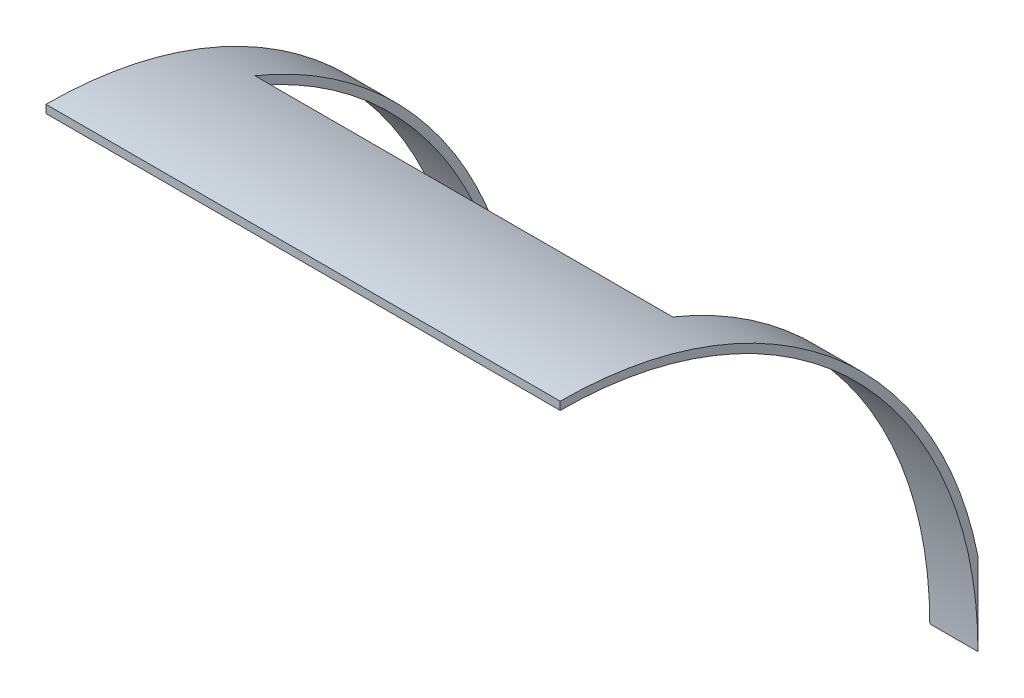
ISO-10303-21;
HEADER;
FILE_DESCRIPTION(('STEP AP214'),'2;1');
FILE_NAME('part.step','',(''),(''),'','','');
FILE_SCHEMA(('AUTOMOTIVE_DESIGN { 1 0 10303 214 1 1 1 1 }'));
ENDSEC;
DATA;
#1=APPLICATION_CONTEXT('core data for automotive mechanical design processes');
#2=APPLICATION_PROTOCOL_DEFINITION('international standard','automotive_design',2000,#1);
#3=PRODUCT_CONTEXT('',#1,'mechanical');
#4=PRODUCT('Part','Part','',(#3));
#5=PRODUCT_RELATED_PRODUCT_CATEGORY('part','',(#4));
#6=PRODUCT_DEFINITION_FORMATION('','',#4);
#7=PRODUCT_DEFINITION_CONTEXT('part definition',#1,'design');
#8=PRODUCT_DEFINITION('design','',#6,#7);
#9=PRODUCT_DEFINITION_SHAPE('','',#8);
#10=(LENGTH_UNIT() NAMED_UNIT(*) SI_UNIT(.MILLI.,.METRE.));
#11=(NAMED_UNIT(*) PLANE_ANGLE_UNIT() SI_UNIT($,.RADIAN.));
#12=(NAMED_UNIT(*) SI_UNIT($,.STERADIAN.) SOLID_ANGLE_UNIT());
#13=UNCERTAINTY_MEASURE_WITH_UNIT(LENGTH_MEASURE(1.E-05),#10,'distance_accuracy_value','');
#14=(GEOMETRIC_REPRESENTATION_CONTEXT(3) GLOBAL_UNCERTAINTY_ASSIGNED_CONTEXT((#13)) GLOBAL_UNIT_ASSIGNED_CONTEXT((#10,
#11,#12)) REPRESENTATION_CONTEXT('',''));
#15=CARTESIAN_POINT('',(0.,0.,0.));
#16=DIRECTION('',(0.,0.,1.));
#17=DIRECTION('',(1.,0.,0.));
#18=AXIS2_PLACEMENT_3D('',#15,#16,#17);
#19=CARTESIAN_POINT('',(-203.2,21.0223484848485,-165.100000000001));
#20=DIRECTION('',(0.,0.,1.));
#21=DIRECTION('',(0.,-1.,0.));
#22=AXIS2_PLACEMENT_3D('',#19,#20,#21);
#23=PLANE('',#22);
#24=DIRECTION('',(1.,0.,0.));
#25=VECTOR('',#24,1.);
#26=CARTESIAN_POINT('',(-168.467424242424,-114.71858283323,-165.1));
#27=LINE('',#26,#25);
#28=CARTESIAN_POINT('',(-203.2,-114.71858283323,-165.1));
#29=VERTEX_POINT('',#28);
#30=CARTESIAN_POINT('',(-184.15,-114.71858283323,-165.1));
#31=VERTEX_POINT('',#30);
#32=EDGE_CURVE('E273',#29,#31,#27,.T.);
#33=ORIENTED_EDGE('',*,*,#32,.T.);
#34=DIRECTION('',(0.,-1.,0.));
#35=VECTOR('',#34,1.);
#36=CARTESIAN_POINT('',(-184.15,21.0223484848485,-165.100000000001));
#37=LINE('',#36,#35);
#38=CARTESIAN_POINT('',(-184.15,-147.252651515152,-165.1));
#39=VERTEX_POINT('',#38);
#40=EDGE_CURVE('E234',#31,#39,#37,.T.);
#41=ORIENTED_EDGE('',*,*,#40,.T.);
#42=DIRECTION('',(1.,0.,0.));
#43=VECTOR('',#42,1.);
#44=CARTESIAN_POINT('',(0.,-147.252651515152,-165.1));
#45=LINE('',#44,#43);
#46=CARTESIAN_POINT('',(-203.2,-147.252651515152,-165.1));
#47=VERTEX_POINT('',#46);
#48=EDGE_CURVE('E210',#47,#39,#45,.T.);
#49=ORIENTED_EDGE('',*,*,#48,.F.);
#50=DIRECTION('',(0.,-1.,0.));
#51=VECTOR('',#50,1.);
#52=CARTESIAN_POINT('',(-203.2,21.0223484848485,-165.100000000001));
#53=LINE('',#52,#51);
#54=EDGE_CURVE('E266',#29,#47,#53,.T.);
#55=ORIENTED_EDGE('',*,*,#54,.F.);
#56=EDGE_LOOP('',(#33,#41,#49,#55));
#57=FACE_BOUND('',#56,.T.);
#58=ADVANCED_FACE('F38',(#57),#23,.F.);
#59=CARTESIAN_POINT('',(0.,-147.252651515152,-165.1));
#60=DIRECTION('',(1.,0.,0.));
#61=DIRECTION('',(0.,0.,-1.));
#62=AXIS2_PLACEMENT_3D('',#59,#60,#61);
#63=PLANE('',#62);
#64=DIRECTION('',(0.,-1.,0.));
#65=VECTOR('',#64,1.);
#66=CARTESIAN_POINT('',(0.,21.0223484848485,-165.100000000001));
#67=LINE('',#66,#65);
#68=CARTESIAN_POINT('',(0.,-114.71858283323,-165.1));
#69=VERTEX_POINT('',#68);
#70=CARTESIAN_POINT('',(0.,-147.252651515152,-165.1));
#71=VERTEX_POINT('',#70);
#72=EDGE_CURVE('E205',#69,#71,#67,.T.);
#73=ORIENTED_EDGE('',*,*,#72,.F.);
#74=CARTESIAN_POINT('',(0.,-147.252651515152,0.));
#75=DIRECTION('',(1.,0.,0.));
#76=DIRECTION('',(0.,0.,-1.));
#77=AXIS2_PLACEMENT_3D('',#74,#75,#76);
#78=CIRCLE('',#77,168.275);
#79=CARTESIAN_POINT('',(0.,21.0223484848485,0.));
#80=VERTEX_POINT('',#79);
#81=EDGE_CURVE('E230',#69,#80,#78,.T.);
#82=ORIENTED_EDGE('',*,*,#81,.T.);
#83=DIRECTION('',(0.,1.,0.));
#84=VECTOR('',#83,1.);
#85=CARTESIAN_POINT('',(0.,17.8473484848485,0.));
#86=LINE('',#85,#84);
#87=CARTESIAN_POINT('',(0.,17.8473484848485,0.));
#88=VERTEX_POINT('',#87);
#89=EDGE_CURVE('E276',#88,#80,#86,.T.);
#90=ORIENTED_EDGE('',*,*,#89,.F.);
#91=CARTESIAN_POINT('',(0.,-147.252651515152,0.));
#92=DIRECTION('',(1.,0.,0.));
#93=DIRECTION('',(0.,0.,-1.));
#94=AXIS2_PLACEMENT_3D('',#91,#92,#93);
#95=CIRCLE('',#94,165.1);
#96=EDGE_CURVE('E216',#71,#88,#95,.T.);
#97=ORIENTED_EDGE('',*,*,#96,.F.);
#98=EDGE_LOOP('',(#73,#82,#90,#97));
#99=FACE_BOUND('',#98,.T.);
#100=ADVANCED_FACE('F150',(#99),#63,.T.);
#101=CARTESIAN_POINT('',(-168.467424242424,-147.252651515152,0.));
#102=DIRECTION('',(1.,0.,0.));
#103=DIRECTION('',(0.,0.,-1.));
#104=AXIS2_PLACEMENT_3D('',#101,#102,#103);
#105=CYLINDRICAL_SURFACE('',#104,168.275);
#106=CARTESIAN_POINT('',(-184.15,-147.252651515152,0.));
#107=DIRECTION('',(-1.,0.,0.));
#108=DIRECTION('',(0.,0.,1.));
#109=AXIS2_PLACEMENT_3D('',#106,#107,#108);
#110=CIRCLE('',#109,168.275);
#111=CARTESIAN_POINT('',(-184.15,8.58131662081041,-63.5));
#112=VERTEX_POINT('',#111);
#113=EDGE_CURVE('E249',#31,#112,#110,.F.);
#114=ORIENTED_EDGE('',*,*,#113,.F.);
#115=ORIENTED_EDGE('',*,*,#32,.F.);
#116=CARTESIAN_POINT('',(-203.2,-147.252651515152,0.));
#117=DIRECTION('',(1.,0.,0.));
#118=DIRECTION('',(0.,0.,-1.));
#119=AXIS2_PLACEMENT_3D('',#116,#117,#118);
#120=CIRCLE('',#119,168.275);
#121=CARTESIAN_POINT('',(-203.2,21.0223484848484,0.));
#122=VERTEX_POINT('',#121);
#123=EDGE_CURVE('E227',#29,#122,#120,.T.);
#124=ORIENTED_EDGE('',*,*,#123,.T.);
#125=DIRECTION('',(-1.,0.,0.));
#126=VECTOR('',#125,1.);
#127=CARTESIAN_POINT('',(0.,21.0223484848485,0.));
#128=LINE('',#127,#126);
#129=EDGE_CURVE('E280',#80,#122,#128,.T.);
#130=ORIENTED_EDGE('',*,*,#129,.F.);
#131=ORIENTED_EDGE('',*,*,#81,.F.);
#132=CARTESIAN_POINT('',(-19.05,-114.71858283323,-165.1));
#133=VERTEX_POINT('',#132);
#134=EDGE_CURVE('E270',#133,#69,#27,.T.);
#135=ORIENTED_EDGE('',*,*,#134,.F.);
#136=CARTESIAN_POINT('',(-19.0499999999999,-147.252651515152,0.));
#137=DIRECTION('',(1.,0.,0.));
#138=DIRECTION('',(0.,0.,-1.));
#139=AXIS2_PLACEMENT_3D('',#136,#137,#138);
#140=CIRCLE('',#139,168.275);
#141=CARTESIAN_POINT('',(-19.05,8.58131662081041,-63.5));
#142=VERTEX_POINT('',#141);
#143=EDGE_CURVE('E255',#142,#133,#140,.F.);
#144=ORIENTED_EDGE('',*,*,#143,.F.);
#145=DIRECTION('',(1.,0.,0.));
#146=VECTOR('',#145,1.);
#147=CARTESIAN_POINT('',(-168.467424242424,8.58131662081041,-63.5));
#148=LINE('',#147,#146);
#149=EDGE_CURVE('E259',#112,#142,#148,.T.);
#150=ORIENTED_EDGE('',*,*,#149,.F.);
#151=EDGE_LOOP('',(#114,#115,#124,#130,#131,#135,#144,#150));
#152=FACE_BOUND('',#151,.T.);
#153=ADVANCED_FACE('F168',(#152),#105,.T.);
#154=CARTESIAN_POINT('',(-203.2,-147.252651515152,-165.1));
#155=DIRECTION('',(-1.,0.,0.));
#156=DIRECTION('',(0.,0.,1.));
#157=AXIS2_PLACEMENT_3D('',#154,#155,#156);
#158=PLANE('',#157);
#159=ORIENTED_EDGE('',*,*,#54,.T.);
#160=CARTESIAN_POINT('',(-203.2,-147.252651515152,0.));
#161=DIRECTION('',(1.,0.,0.));
#162=DIRECTION('',(0.,0.,-1.));
#163=AXIS2_PLACEMENT_3D('',#160,#161,#162);
#164=CIRCLE('',#163,165.1);
#165=CARTESIAN_POINT('',(-203.2,17.8473484848484,0.));
#166=VERTEX_POINT('',#165);
#167=EDGE_CURVE('E224',#47,#166,#164,.T.);
#168=ORIENTED_EDGE('',*,*,#167,.T.);
#169=DIRECTION('',(0.,-1.,0.));
#170=VECTOR('',#169,1.);
#171=CARTESIAN_POINT('',(-203.2,17.8473484848484,0.));
#172=LINE('',#171,#170);
#173=EDGE_CURVE('E218',#122,#166,#172,.T.);
#174=ORIENTED_EDGE('',*,*,#173,.F.);
#175=ORIENTED_EDGE('',*,*,#123,.F.);
#176=EDGE_LOOP('',(#159,#168,#174,#175));
#177=FACE_BOUND('',#176,.T.);
#178=ADVANCED_FACE('F149',(#177),#158,.T.);
#179=CARTESIAN_POINT('',(-168.467424242424,-147.252651515152,0.));
#180=DIRECTION('',(1.,0.,0.));
#181=DIRECTION('',(0.,0.,-1.));
#182=AXIS2_PLACEMENT_3D('',#179,#180,#181);
#183=CYLINDRICAL_SURFACE('',#182,165.1);
#184=CARTESIAN_POINT('',(-114.088881491951,9.89312701008041,-50.6281966072142));
#185=CARTESIAN_POINT('',(-113.953864967336,9.89648283792673,-50.6177679238339));
#186=CARTESIAN_POINT('',(-113.8197646852,9.90314322707458,-50.5971034012265));
#187=CARTESIAN_POINT('',(-113.556579227393,9.92275957601486,-50.536140585704));
#188=CARTESIAN_POINT('',(-113.427494010849,9.93571548448531,-50.4958424528449));
#189=CARTESIAN_POINT('',(-113.168218921054,9.9687959669173,-50.3927523318355));
#190=CARTESIAN_POINT('',(-113.038661540678,9.98938221629171,-50.3285097323128));
#191=CARTESIAN_POINT('',(-112.792773388055,10.0367911861759,-50.1801482695945));
#192=CARTESIAN_POINT('',(-112.676441066389,10.0636131749964,-50.0960317383481));
#193=CARTESIAN_POINT('',(-112.46060136038,10.1225722221402,-49.910503605895));
#194=CARTESIAN_POINT('',(-112.361050899353,10.1546952401958,-49.8091376697895));
#195=CARTESIAN_POINT('',(-112.181243779611,10.223303379392,-49.5917996601005));
#196=CARTESIAN_POINT('',(-112.100989230724,10.2597889768877,-49.4758259914081));
#197=CARTESIAN_POINT('',(-111.962189231237,10.3359234029204,-49.2327860323058));
#198=CARTESIAN_POINT('',(-111.903604977116,10.375566421402,-49.105740077474));
#199=CARTESIAN_POINT('',(-111.809567792174,10.4568745862024,-48.8439775591242));
#200=CARTESIAN_POINT('',(-111.774113734367,10.4985396338944,-48.709261369675));
#201=CARTESIAN_POINT('',(-111.727229487801,10.5827509081338,-48.435691960157));
#202=CARTESIAN_POINT('',(-111.71584535929,10.6252986670888,-48.2968313230232));
#203=CARTESIAN_POINT('',(-111.717489810818,10.7099848109688,-48.0191274483818));
#204=CARTESIAN_POINT('',(-111.730519575769,10.7521231759244,-47.8802842120457));
#205=CARTESIAN_POINT('',(-111.780693326579,10.8350311075397,-47.6058322128621));
#206=CARTESIAN_POINT('',(-111.81795606898,10.8757928877095,-47.4702428070376));
#207=CARTESIAN_POINT('',(-111.915624553837,10.9546277485847,-47.2068395959073));
#208=CARTESIAN_POINT('',(-111.976030840499,10.9927007660405,-47.0790259735262));
#209=CARTESIAN_POINT('',(-112.118566401146,11.0652990206616,-46.8343133877871));
#210=CARTESIAN_POINT('',(-112.200779679955,11.0998098054907,-46.7174590499745));
#211=CARTESIAN_POINT('',(-112.3845180036,11.1642138195618,-46.4986001368616));
#212=CARTESIAN_POINT('',(-112.486043072292,11.1941070431,-46.3965955799047));
#213=CARTESIAN_POINT('',(-112.705421196394,11.2484681118335,-46.2105451481514));
#214=CARTESIAN_POINT('',(-112.823252997838,11.2729429130869,-46.1264762530242));
#215=CARTESIAN_POINT('',(-113.07202236283,11.3158832715007,-45.9786442206666));
#216=CARTESIAN_POINT('',(-113.202959433907,11.3343490543581,-45.9148803207883));
#217=CARTESIAN_POINT('',(-113.473322214288,11.3646930923856,-45.8099440218837));
#218=CARTESIAN_POINT('',(-113.612687560275,11.3766131713524,-45.7686282091056));
#219=CARTESIAN_POINT('',(-113.896681450781,11.3937389278678,-45.7092306539477));
#220=CARTESIAN_POINT('',(-114.041309762981,11.3989449014232,-45.6911478872857));
#221=CARTESIAN_POINT('',(-114.330695078611,11.402495590362,-45.6788171745483));
#222=CARTESIAN_POINT('',(-114.475444828047,11.4008857107417,-45.6844114993092));
#223=CARTESIAN_POINT('',(-114.761902576745,11.3909493370748,-45.7189044551592));
#224=CARTESIAN_POINT('',(-114.903610616054,11.3826229315178,-45.7478027792203));
#225=CARTESIAN_POINT('',(-115.179804909472,11.3594813382026,-45.8279721913004));
#226=CARTESIAN_POINT('',(-115.314299537102,11.3446738652349,-45.8792166791169));
#227=CARTESIAN_POINT('',(-115.572492447375,11.3089481352383,-46.0025349005448));
#228=CARTESIAN_POINT('',(-115.696190447911,11.2880297185975,-46.0746091782093));
#229=CARTESIAN_POINT('',(-115.929993132431,11.2404835568521,-46.2378998254948));
#230=CARTESIAN_POINT('',(-116.040022768986,11.2138263136902,-46.3292150416234));
#231=CARTESIAN_POINT('',(-116.242696457055,11.1555429795383,-46.5281058322064));
#232=CARTESIAN_POINT('',(-116.33533975823,11.1239166742078,-46.6356821080746));
#233=CARTESIAN_POINT('',(-116.501300487752,11.0562527039236,-46.8648610231501));
#234=CARTESIAN_POINT('',(-116.574473265183,11.0201847823264,-46.9865594991959));
#235=CARTESIAN_POINT('',(-116.698560579972,10.9447599424912,-47.2398820435919));
#236=CARTESIAN_POINT('',(-116.749474599546,10.9054029477679,-47.3715063427536));
#237=CARTESIAN_POINT('',(-116.827726652955,10.8243069792286,-47.6414221460968));
#238=CARTESIAN_POINT('',(-116.854983130664,10.7825602901794,-47.7797349922863));
#239=CARTESIAN_POINT('',(-116.88479630023,10.6979602366697,-48.0586670755109));
#240=CARTESIAN_POINT('',(-116.887353223117,10.6551068825643,-48.1992862909607));
#241=CARTESIAN_POINT('',(-116.867650934016,10.5696171947503,-48.4784773505632));
#242=CARTESIAN_POINT('',(-116.845450726748,10.5269805872944,-48.6170532685359));
#243=CARTESIAN_POINT('',(-116.776896378733,10.4430740524975,-48.888529663555));
#244=CARTESIAN_POINT('',(-116.730542772525,10.4018040949326,-49.0214302661315));
#245=CARTESIAN_POINT('',(-116.615262369301,10.3220846140373,-49.2770777371137));
#246=CARTESIAN_POINT('',(-116.546452317756,10.2836217365699,-49.3998730917904));
#247=CARTESIAN_POINT('',(-116.388143345511,10.2104679246595,-49.6325589897216));
#248=CARTESIAN_POINT('',(-116.298646439971,10.1757766233011,-49.7424507883743));
#249=CARTESIAN_POINT('',(-116.10185864646,10.1113548631358,-49.9458793761021));
#250=CARTESIAN_POINT('',(-115.994629475148,10.0816078916347,-50.0394706566557));
#251=CARTESIAN_POINT('',(-115.765165063234,10.0278505288875,-50.2081820703109));
#252=CARTESIAN_POINT('',(-115.642923446735,10.0038425878935,-50.2832943142727));
#253=CARTESIAN_POINT('',(-115.38679097086,9.96230392416413,-50.4130185415438));
#254=CARTESIAN_POINT('',(-115.252883611301,9.94478256609431,-50.4676008876864));
#255=CARTESIAN_POINT('',(-114.977550495011,9.91684788560559,-50.5545310096153));
#256=CARTESIAN_POINT('',(-114.836139479244,9.90642114520455,-50.5869207588612));
#257=CARTESIAN_POINT('',(-114.632632217169,9.89683561697325,-50.61668401816));
#258=CARTESIAN_POINT('',(-114.571947084054,9.89464747085823,-50.6234756740519));
#259=CARTESIAN_POINT('',(-114.51111850805,9.89312701008042,-50.6281966072142));
#260=B_SPLINE_CURVE_WITH_KNOTS('',3,(#184,#185,#186,#187,#188,#189,#190,#191,#192,#193,#194,
#195,#196,#197,#198,#199,#200,#201,#202,#203,#204,#205,#206,#207,#208,#209,#210,#211,#212,#213,
#214,#215,#216,#217,#218,#219,#220,#221,#222,#223,#224,#225,#226,#227,#228,#229,#230,#231,#232,
#233,#234,#235,#236,#237,#238,#239,#240,#241,#242,#243,#244,#245,#246,#247,#248,#249,#250,#251,
#252,#253,#254,#255,#256,#257,#258,#259),.UNSPECIFIED.,.F.,.F.,(4,2,2,2,2,2,2,2,2,2,2,2,2,2,2,2,
2,2,2,2,2,2,2,2,2,2,2,2,2,2,2,2,2,2,2,2,2,4),(0.,0.405897792881434,0.811792276881501,
1.24788858801271,1.68393375426732,2.11884202389486,2.55379782509393,2.98797096643424,
3.42212295172905,3.85710498170018,4.29210812378009,4.72925927936226,5.16642071492141,
5.6052912756162,6.04416237842587,6.48246675773591,6.92075467255581,7.35620855686503,
7.79164324252874,8.22418178422561,8.65671462736075,9.08873399590572,9.52076464938411,
9.95507138511682,10.3893968598327,10.8268642336805,11.2643417833822,11.7033215540623,
12.1422972186679,12.5802288857055,13.0181508612885,13.4538315199418,13.8894697556654,
14.3236225005022,14.7579602750679,15.192922679172,15.6270601392852,15.8102048139839),.UNSPECIFIED.);
#261=CARTESIAN_POINT('',(-111.7473,10.7790171564204,-47.7912303344296));
#262=VERTEX_POINT('',#261);
#263=CARTESIAN_POINT('',(-116.8527,10.7790171564204,-47.7912303344296));
#264=VERTEX_POINT('',#263);
#265=EDGE_CURVE('E11',#262,#264,#260,.T.);
#266=ORIENTED_EDGE('',*,*,#265,.F.);
#267=CARTESIAN_POINT('',(-116.8527,10.7790171564204,-47.7912303344296));
#268=CARTESIAN_POINT('',(-116.852706723487,10.7580984438365,-47.8604040083973));
#269=CARTESIAN_POINT('',(-116.849657770327,10.7371343055739,-47.9295608281803));
#270=CARTESIAN_POINT('',(-116.837498221817,10.6952655628439,-48.0673552008376));
#271=CARTESIAN_POINT('',(-116.828387830451,10.6743609563968,-48.1359927711074));
#272=CARTESIAN_POINT('',(-116.804161941685,10.6327719617872,-48.2722293904731));
#273=CARTESIAN_POINT('',(-116.789049832891,10.6120874561095,-48.3398290032742));
#274=CARTESIAN_POINT('',(-116.752938667079,10.5710854080629,-48.4735284812327));
#275=CARTESIAN_POINT('',(-116.731939701466,10.5507678600014,-48.5396283696592));
#276=CARTESIAN_POINT('',(-116.660272023001,10.4905686320245,-48.7350489437571));
#277=CARTESIAN_POINT('',(-116.600923960506,10.4514257165825,-48.8615385031071));
#278=CARTESIAN_POINT('',(-116.460832289864,10.3764145034923,-49.1029896073938));
#279=CARTESIAN_POINT('',(-116.380093856331,10.3405454166796,-49.2179539311776));
#280=CARTESIAN_POINT('',(-116.199674104274,10.2732408774229,-49.4329433956312));
#281=CARTESIAN_POINT('',(-116.100037978656,10.2417951529897,-49.533003180788));
#282=CARTESIAN_POINT('',(-115.884502224959,10.1842382322724,-49.7156408578967));
#283=CARTESIAN_POINT('',(-115.76860027764,10.1581277980201,-49.7982162526389));
#284=CARTESIAN_POINT('',(-115.524279842504,10.1121724651621,-49.9432473978637));
#285=CARTESIAN_POINT('',(-115.395907486865,10.0923055445948,-50.0057738805716));
#286=CARTESIAN_POINT('',(-115.129958815834,10.0593600115418,-50.109320485987));
#287=CARTESIAN_POINT('',(-114.992383246034,10.0462808499008,-50.1503423485027));
#288=CARTESIAN_POINT('',(-114.712306765172,10.0273634771873,-50.2096391155746));
#289=CARTESIAN_POINT('',(-114.569819441666,10.0215067168252,-50.227972291907));
#290=CARTESIAN_POINT('',(-114.283634257981,10.0171653950384,-50.2415638959183));
#291=CARTESIAN_POINT('',(-114.139936380342,10.018680940138,-50.2368219901793));
#292=CARTESIAN_POINT('',(-113.855582444351,10.0290286430437,-50.2044158347068));
#293=CARTESIAN_POINT('',(-113.714923150439,10.0378525801793,-50.1767773396476));
#294=CARTESIAN_POINT('',(-113.440468805916,10.0625167662864,-50.0993958441475));
#295=CARTESIAN_POINT('',(-113.306673730611,10.078356990014,-50.0496529232361));
#296=CARTESIAN_POINT('',(-113.049661220135,10.1165482110865,-49.9294395866035));
#297=CARTESIAN_POINT('',(-112.926449538155,10.1389027209925,-49.8589579882031));
#298=CARTESIAN_POINT('',(-112.694161755166,10.1893980408288,-49.6992758415473));
#299=CARTESIAN_POINT('',(-112.585085074511,10.2175386133623,-49.6100760612785));
#300=CARTESIAN_POINT('',(-112.383918579943,10.2787738727269,-49.4152854478491));
#301=CARTESIAN_POINT('',(-112.291862180267,10.3118780783196,-49.3096631064216));
#302=CARTESIAN_POINT('',(-112.127537438532,10.3819820224861,-49.0850906227843));
#303=CARTESIAN_POINT('',(-112.05527563683,10.418983043034,-48.9661360937203));
#304=CARTESIAN_POINT('',(-111.93233765924,10.4958842010233,-48.7178246385475));
#305=CARTESIAN_POINT('',(-111.881746110721,10.5357950049176,-48.5884292329906));
#306=CARTESIAN_POINT('',(-111.803999253733,10.6171719522911,-48.3233687522778));
#307=CARTESIAN_POINT('',(-111.776809114573,10.6586356880535,-48.1877133127778));
#308=CARTESIAN_POINT('',(-111.756861158975,10.7133668208273,-48.0078026466238));
#309=CARTESIAN_POINT('',(-111.753273631802,10.7265119018791,-47.9645284276489));
#310=CARTESIAN_POINT('',(-111.748496322787,10.7527811820205,-47.8779205111355));
#311=CARTESIAN_POINT('',(-111.747302549931,10.7659053793535,-47.8345870333387));
#312=CARTESIAN_POINT('',(-111.7473,10.7790171564204,-47.7912303344296));
#313=B_SPLINE_CURVE_WITH_KNOTS('',3,(#267,#268,#269,#270,#271,#272,#273,#274,#275,#276,#277,
#278,#279,#280,#281,#282,#283,#284,#285,#286,#287,#288,#289,#290,#291,#292,#293,#294,#295,#296,
#297,#298,#299,#300,#301,#302,#303,#304,#305,#306,#307,#308,#309,#310,#311,#312),.UNSPECIFIED.,
.F.,.F.,(4,2,2,2,2,2,2,2,2,2,2,2,2,2,2,2,2,2,2,2,2,2,4),(0.,0.216732674808425,0.433458056364749,
0.650061247032096,0.866661074657473,1.29971001569877,1.73265429200337,2.16457596813762,
2.59655929197831,3.02700137516794,3.45740862852715,3.88670814930032,4.31601387315273,
4.74483735747291,5.17365929893839,5.60271289421249,6.03174888932852,6.4616184265804,
6.8916298266928,7.32330554061443,7.7543376311036,7.89039947820821,8.02623428549849),.UNSPECIFIED.);
#314=EDGE_CURVE('E52',#264,#262,#313,.T.);
#315=ORIENTED_EDGE('',*,*,#314,.F.);
#316=EDGE_LOOP('',(#266,#315));
#317=FACE_BOUND('',#316,.T.);
#318=CARTESIAN_POINT('',(-63.2888814919507,9.89312701008041,-50.6281966072142));
#319=CARTESIAN_POINT('',(-63.1538649673364,9.89648283792672,-50.6177679238339));
#320=CARTESIAN_POINT('',(-63.0197646851999,9.90314322707457,-50.5971034012264));
#321=CARTESIAN_POINT('',(-62.7565792273932,9.92275957601485,-50.5361405857039));
#322=CARTESIAN_POINT('',(-62.6274940108488,9.9357154844853,-50.4958424528449));
#323=CARTESIAN_POINT('',(-62.3682189210545,9.96879596691729,-50.3927523318356));
#324=CARTESIAN_POINT('',(-62.2386615406784,9.98938221629169,-50.3285097323128));
#325=CARTESIAN_POINT('',(-61.9927733880555,10.0367911861759,-50.1801482695945));
#326=CARTESIAN_POINT('',(-61.8764410663891,10.0636131749964,-50.0960317383482));
#327=CARTESIAN_POINT('',(-61.6606013603798,10.1225722221402,-49.9105036058951));
#328=CARTESIAN_POINT('',(-61.5610508993528,10.1546952401957,-49.8091376697896));
#329=CARTESIAN_POINT('',(-61.3812437796106,10.223303379392,-49.5917996601006));
#330=CARTESIAN_POINT('',(-61.3009892307241,10.2597889768877,-49.4758259914081));
#331=CARTESIAN_POINT('',(-61.1621892312365,10.3359234029204,-49.2327860323059));
#332=CARTESIAN_POINT('',(-61.1036049771164,10.375566421402,-49.1057400774741));
#333=CARTESIAN_POINT('',(-61.0095677921743,10.4568745862023,-48.8439775591242));
#334=CARTESIAN_POINT('',(-60.9741137343667,10.4985396338943,-48.7092613696751));
#335=CARTESIAN_POINT('',(-60.9272294878007,10.5827509081337,-48.435691960157));
#336=CARTESIAN_POINT('',(-60.9158453592903,10.6252986670887,-48.2968313230233));
#337=CARTESIAN_POINT('',(-60.9174898108183,10.7099848109687,-48.0191274483819));
#338=CARTESIAN_POINT('',(-60.9305195757687,10.7521231759244,-47.8802842120458));
#339=CARTESIAN_POINT('',(-60.9806933265787,10.8350311075397,-47.6058322128622));
#340=CARTESIAN_POINT('',(-61.0179560689803,10.8757928877094,-47.4702428070377));
#341=CARTESIAN_POINT('',(-61.1156245538372,10.9546277485846,-47.2068395959073));
#342=CARTESIAN_POINT('',(-61.176030840499,10.9927007660405,-47.0790259735263));
#343=CARTESIAN_POINT('',(-61.3185664011458,11.0652990206616,-46.8343133877872));
#344=CARTESIAN_POINT('',(-61.4007796799547,11.0998098054907,-46.7174590499746));
#345=CARTESIAN_POINT('',(-61.5845180036004,11.1642138195618,-46.4986001368617));
#346=CARTESIAN_POINT('',(-61.686043072292,11.1941070431,-46.3965955799047));
#347=CARTESIAN_POINT('',(-61.9054211963943,11.2484681118335,-46.2105451481515));
#348=CARTESIAN_POINT('',(-62.0232529978379,11.2729429130869,-46.1264762530242));
#349=CARTESIAN_POINT('',(-62.2720223628301,11.3158832715007,-45.9786442206666));
#350=CARTESIAN_POINT('',(-62.4029594339068,11.3343490543581,-45.9148803207883));
#351=CARTESIAN_POINT('',(-62.6733222142877,11.3646930923856,-45.8099440218838));
#352=CARTESIAN_POINT('',(-62.8126875602749,11.3766131713524,-45.7686282091056));
#353=CARTESIAN_POINT('',(-63.0966814507808,11.3937389278678,-45.7092306539477));
#354=CARTESIAN_POINT('',(-63.2413097629805,11.3989449014232,-45.6911478872857));
#355=CARTESIAN_POINT('',(-63.5306950786111,11.402495590362,-45.6788171745483));
#356=CARTESIAN_POINT('',(-63.6754448280474,11.4008857107417,-45.6844114993092));
#357=CARTESIAN_POINT('',(-63.9619025767446,11.3909493370748,-45.7189044551592));
#358=CARTESIAN_POINT('',(-64.1036106160544,11.3826229315178,-45.7478027792203));
#359=CARTESIAN_POINT('',(-64.3798049094723,11.3594813382026,-45.8279721913004));
#360=CARTESIAN_POINT('',(-64.5142995371022,11.3446738652349,-45.8792166791169));
#361=CARTESIAN_POINT('',(-64.7724924473752,11.3089481352383,-46.0025349005447));
#362=CARTESIAN_POINT('',(-64.8961904479113,11.2880297185975,-46.0746091782093));
#363=CARTESIAN_POINT('',(-65.1299931324312,11.2404835568522,-46.2378998254947));
#364=CARTESIAN_POINT('',(-65.2400227689863,11.2138263136902,-46.3292150416233));
#365=CARTESIAN_POINT('',(-65.4426964570549,11.1555429795384,-46.5281058322063));
#366=CARTESIAN_POINT('',(-65.5353397582295,11.1239166742078,-46.6356821080745));
#367=CARTESIAN_POINT('',(-65.7013004877523,11.0562527039236,-46.86486102315));
#368=CARTESIAN_POINT('',(-65.7744732651825,11.0201847823264,-46.9865594991959));
#369=CARTESIAN_POINT('',(-65.8985605799719,10.9447599424912,-47.2398820435918));
#370=CARTESIAN_POINT('',(-65.9494745995464,10.9054029477679,-47.3715063427535));
#371=CARTESIAN_POINT('',(-66.0277266529546,10.8243069792286,-47.6414221460968));
#372=CARTESIAN_POINT('',(-66.0549831306643,10.7825602901794,-47.7797349922863));
#373=CARTESIAN_POINT('',(-66.0847963002298,10.6979602366697,-48.0586670755108));
#374=CARTESIAN_POINT('',(-66.087353223117,10.6551068825644,-48.1992862909606));
#375=CARTESIAN_POINT('',(-66.0676509340164,10.5696171947503,-48.4784773505631));
#376=CARTESIAN_POINT('',(-66.0454507267478,10.5269805872944,-48.6170532685357));
#377=CARTESIAN_POINT('',(-65.9768963787326,10.4430740524975,-48.8885296635549));
#378=CARTESIAN_POINT('',(-65.9305427725248,10.4018040949327,-49.0214302661314));
#379=CARTESIAN_POINT('',(-65.8152623693011,10.3220846140373,-49.2770777371136));
#380=CARTESIAN_POINT('',(-65.7464523177563,10.2836217365699,-49.3998730917903));
#381=CARTESIAN_POINT('',(-65.5881433455108,10.2104679246596,-49.6325589897216));
#382=CARTESIAN_POINT('',(-65.4986464399711,10.1757766233011,-49.7424507883742));
#383=CARTESIAN_POINT('',(-65.3018586464602,10.1113548631358,-49.9458793761021));
#384=CARTESIAN_POINT('',(-65.1946294751484,10.0816078916347,-50.0394706566557));
#385=CARTESIAN_POINT('',(-64.9651650632345,10.0278505288876,-50.2081820703109));
#386=CARTESIAN_POINT('',(-64.8429234467355,10.0038425878935,-50.2832943142726));
#387=CARTESIAN_POINT('',(-64.58679097086,9.96230392416414,-50.4130185415438));
#388=CARTESIAN_POINT('',(-64.452883611301,9.94478256609433,-50.4676008876864));
#389=CARTESIAN_POINT('',(-64.1775504950112,9.9168478856056,-50.5545310096153));
#390=CARTESIAN_POINT('',(-64.0361394792443,9.90642114520456,-50.5869207588611));
#391=CARTESIAN_POINT('',(-63.8326322171694,9.89683561697325,-50.61668401816));
#392=CARTESIAN_POINT('',(-63.7719470840541,9.89464747085824,-50.6234756740519));
#393=CARTESIAN_POINT('',(-63.7111185080496,9.89312701008042,-50.6281966072142));
#394=B_SPLINE_CURVE_WITH_KNOTS('',3,(#318,#319,#320,#321,#322,#323,#324,#325,#326,#327,#328,
#329,#330,#331,#332,#333,#334,#335,#336,#337,#338,#339,#340,#341,#342,#343,#344,#345,#346,#347,
#348,#349,#350,#351,#352,#353,#354,#355,#356,#357,#358,#359,#360,#361,#362,#363,#364,#365,#366,
#367,#368,#369,#370,#371,#372,#373,#374,#375,#376,#377,#378,#379,#380,#381,#382,#383,#384,#385,
#386,#387,#388,#389,#390,#391,#392,#393),.UNSPECIFIED.,.F.,.F.,(4,2,2,2,2,2,2,2,2,2,2,2,2,2,2,2,
2,2,2,2,2,2,2,2,2,2,2,2,2,2,2,2,2,2,2,2,2,4),(0.,0.405897792881439,0.811792276881505,
1.24788858801268,1.68393375426732,2.11884202389484,2.55379782509391,2.98797096643421,
3.42212295172903,3.85710498170016,4.29210812378006,4.72925927936223,5.16642071492138,
5.60529127561616,6.04416237842583,6.48246675773588,6.92075467255578,7.356208556865,
7.79164324252871,8.2241817842256,8.65671462736073,9.08873399590569,9.52076464938408,
9.95507138511678,10.3893968598326,10.8268642336804,11.2643417833822,11.7033215540623,
12.1422972186679,12.5802288857054,13.0181508612884,13.4538315199417,13.8894697556653,
14.3236225005021,14.7579602750678,15.1929226791719,15.6270601392851,15.810204813984),.UNSPECIFIED.);
#395=CARTESIAN_POINT('',(-60.9473,10.7790171564204,-47.7912303344296));
#396=VERTEX_POINT('',#395);
#397=CARTESIAN_POINT('',(-66.0527,10.7790171564204,-47.7912303344296));
#398=VERTEX_POINT('',#397);
#399=EDGE_CURVE('E130',#396,#398,#394,.T.);
#400=ORIENTED_EDGE('',*,*,#399,.F.);
#401=CARTESIAN_POINT('',(-66.0527,10.7790171564204,-47.7912303344296));
#402=CARTESIAN_POINT('',(-66.0527067234873,10.7580984438365,-47.8604040083973));
#403=CARTESIAN_POINT('',(-66.0496577703268,10.7371343055739,-47.9295608281803));
#404=CARTESIAN_POINT('',(-66.0374982218168,10.6952655628439,-48.0673552008376));
#405=CARTESIAN_POINT('',(-66.0283878304507,10.6743609563968,-48.1359927711074));
#406=CARTESIAN_POINT('',(-66.0041619416849,10.6327719617872,-48.2722293904731));
#407=CARTESIAN_POINT('',(-65.9890498328911,10.6120874561095,-48.3398290032742));
#408=CARTESIAN_POINT('',(-65.9529386670789,10.5710854080629,-48.4735284812327));
#409=CARTESIAN_POINT('',(-65.9319397014664,10.5507678600014,-48.5396283696592));
#410=CARTESIAN_POINT('',(-65.860272023001,10.4905686320245,-48.7350489437571));
#411=CARTESIAN_POINT('',(-65.8009239605059,10.4514257165825,-48.8615385031071));
#412=CARTESIAN_POINT('',(-65.6608322898644,10.3764145034923,-49.1029896073938));
#413=CARTESIAN_POINT('',(-65.5800938563305,10.3405454166796,-49.2179539311776));
#414=CARTESIAN_POINT('',(-65.3996741042744,10.2732408774229,-49.4329433956312));
#415=CARTESIAN_POINT('',(-65.3000379786555,10.2417951529897,-49.533003180788));
#416=CARTESIAN_POINT('',(-65.0845022249594,10.1842382322724,-49.7156408578967));
#417=CARTESIAN_POINT('',(-64.9686002776401,10.1581277980201,-49.7982162526389));
#418=CARTESIAN_POINT('',(-64.7242798425039,10.1121724651621,-49.9432473978637));
#419=CARTESIAN_POINT('',(-64.5959074868646,10.0923055445948,-50.0057738805716));
#420=CARTESIAN_POINT('',(-64.3299588158338,10.0593600115418,-50.109320485987));
#421=CARTESIAN_POINT('',(-64.1923832460342,10.0462808499008,-50.1503423485027));
#422=CARTESIAN_POINT('',(-63.9123067651721,10.0273634771873,-50.2096391155746));
#423=CARTESIAN_POINT('',(-63.7698194416657,10.0215067168252,-50.227972291907));
#424=CARTESIAN_POINT('',(-63.4836342579814,10.0171653950384,-50.2415638959183));
#425=CARTESIAN_POINT('',(-63.3399363803419,10.018680940138,-50.2368219901793));
#426=CARTESIAN_POINT('',(-63.0555824443505,10.0290286430437,-50.2044158347068));
#427=CARTESIAN_POINT('',(-62.9149231504389,10.0378525801793,-50.1767773396476));
#428=CARTESIAN_POINT('',(-62.6404688059165,10.0625167662864,-50.0993958441475));
#429=CARTESIAN_POINT('',(-62.5066737306109,10.078356990014,-50.0496529232361));
#430=CARTESIAN_POINT('',(-62.2496612201352,10.1165482110865,-49.9294395866035));
#431=CARTESIAN_POINT('',(-62.1264495381548,10.1389027209925,-49.8589579882031));
#432=CARTESIAN_POINT('',(-61.8941617551663,10.1893980408287,-49.6992758415473));
#433=CARTESIAN_POINT('',(-61.7850850745114,10.2175386133623,-49.6100760612785));
#434=CARTESIAN_POINT('',(-61.5839185799426,10.2787738727269,-49.4152854478491));
#435=CARTESIAN_POINT('',(-61.4918621802667,10.3118780783196,-49.3096631064216));
#436=CARTESIAN_POINT('',(-61.3275374385319,10.3819820224861,-49.0850906227843));
#437=CARTESIAN_POINT('',(-61.25527563683,10.418983043034,-48.9661360937203));
#438=CARTESIAN_POINT('',(-61.1323376592403,10.4958842010233,-48.7178246385475));
#439=CARTESIAN_POINT('',(-61.0817461107211,10.5357950049176,-48.5884292329906));
#440=CARTESIAN_POINT('',(-61.0039992537331,10.6171719522911,-48.3233687522778));
#441=CARTESIAN_POINT('',(-60.9768091145725,10.6586356880536,-48.1877133127778));
#442=CARTESIAN_POINT('',(-60.9568611589749,10.7133668208273,-48.0078026466238));
#443=CARTESIAN_POINT('',(-60.9532736318024,10.7265119018791,-47.9645284276489));
#444=CARTESIAN_POINT('',(-60.9484963227868,10.7527811820205,-47.8779205111355));
#445=CARTESIAN_POINT('',(-60.9473025499313,10.7659053793535,-47.8345870333387));
#446=CARTESIAN_POINT('',(-60.9473,10.7790171564204,-47.7912303344296));
#447=B_SPLINE_CURVE_WITH_KNOTS('',3,(#401,#402,#403,#404,#405,#406,#407,#408,#409,#410,#411,
#412,#413,#414,#415,#416,#417,#418,#419,#420,#421,#422,#423,#424,#425,#426,#427,#428,#429,#430,
#431,#432,#433,#434,#435,#436,#437,#438,#439,#440,#441,#442,#443,#444,#445,#446),.UNSPECIFIED.,
.F.,.F.,(4,2,2,2,2,2,2,2,2,2,2,2,2,2,2,2,2,2,2,2,2,2,4),(0.,0.216732674808426,0.433458056364749,
0.650061247032096,0.866661074657473,1.29971001569877,1.73265429200338,2.16457596813764,
2.59655929197833,3.02700137516795,3.45740862852715,3.88670814930036,4.31601387315273,
4.74483735747292,5.17365929893839,5.60271289421246,6.03174888932851,6.46161842658039,
6.8916298266928,7.32330554061444,7.75433763110359,7.89039947820821,8.02623428549848),.UNSPECIFIED.);
#448=EDGE_CURVE('E132',#398,#396,#447,.T.);
#449=ORIENTED_EDGE('',*,*,#448,.F.);
#450=EDGE_LOOP('',(#400,#449));
#451=FACE_BOUND('',#450,.T.);
#452=CARTESIAN_POINT('',(-184.15,-147.252651515152,0.));
#453=DIRECTION('',(-1.,0.,0.));
#454=DIRECTION('',(0.,0.,1.));
#455=AXIS2_PLACEMENT_3D('',#452,#453,#454);
#456=CIRCLE('',#455,165.1);
#457=CARTESIAN_POINT('',(-184.15,5.14734848484844,-63.5));
#458=VERTEX_POINT('',#457);
#459=EDGE_CURVE('E248',#458,#39,#456,.T.);
#460=ORIENTED_EDGE('',*,*,#459,.F.);
#461=DIRECTION('',(1.,0.,0.));
#462=VECTOR('',#461,1.);
#463=CARTESIAN_POINT('',(-168.467424242424,5.14734848484844,-63.5));
#464=LINE('',#463,#462);
#465=CARTESIAN_POINT('',(-19.05,5.14734848484841,-63.5));
#466=VERTEX_POINT('',#465);
#467=EDGE_CURVE('E163',#466,#458,#464,.F.);
#468=ORIENTED_EDGE('',*,*,#467,.F.);
#469=CARTESIAN_POINT('',(-19.0499999999999,-147.252651515152,0.));
#470=DIRECTION('',(1.,0.,0.));
#471=DIRECTION('',(0.,0.,-1.));
#472=AXIS2_PLACEMENT_3D('',#469,#470,#471);
#473=CIRCLE('',#472,165.1);
#474=CARTESIAN_POINT('',(-19.05,-147.252651515152,-165.1));
#475=VERTEX_POINT('',#474);
#476=EDGE_CURVE('E251',#475,#466,#473,.T.);
#477=ORIENTED_EDGE('',*,*,#476,.F.);
#478=EDGE_CURVE('E201',#475,#71,#45,.T.);
#479=ORIENTED_EDGE('',*,*,#478,.T.);
#480=ORIENTED_EDGE('',*,*,#96,.T.);
#481=DIRECTION('',(1.,0.,0.));
#482=VECTOR('',#481,1.);
#483=CARTESIAN_POINT('',(0.,17.8473484848485,0.));
#484=LINE('',#483,#482);
#485=EDGE_CURVE('E211',#166,#88,#484,.T.);
#486=ORIENTED_EDGE('',*,*,#485,.F.);
#487=ORIENTED_EDGE('',*,*,#167,.F.);
#488=ORIENTED_EDGE('',*,*,#48,.T.);
#489=EDGE_LOOP('',(#460,#468,#477,#479,#480,#486,#487,#488));
#490=FACE_BOUND('',#489,.T.);
#491=ADVANCED_FACE('F127',(#317,#451,#490),#183,.F.);
#492=CARTESIAN_POINT('',(0.,0.,0.));
#493=DIRECTION('',(0.,0.,1.));
#494=DIRECTION('',(1.,0.,0.));
#495=AXIS2_PLACEMENT_3D('',#492,#493,#494);
#496=PLANE('',#495);
#497=ORIENTED_EDGE('',*,*,#89,.T.);
#498=ORIENTED_EDGE('',*,*,#129,.T.);
#499=ORIENTED_EDGE('',*,*,#173,.T.);
#500=ORIENTED_EDGE('',*,*,#485,.T.);
#501=EDGE_LOOP('',(#497,#498,#499,#500));
#502=FACE_BOUND('',#501,.T.);
#503=ADVANCED_FACE('F148',(#502),#496,.T.);
#504=ORIENTED_EDGE('',*,*,#478,.F.);
#505=DIRECTION('',(0.,1.,0.));
#506=VECTOR('',#505,1.);
#507=CARTESIAN_POINT('',(-19.05,21.0223484848485,-165.100000000001));
#508=LINE('',#507,#506);
#509=EDGE_CURVE('E202',#475,#133,#508,.T.);
#510=ORIENTED_EDGE('',*,*,#509,.T.);
#511=ORIENTED_EDGE('',*,*,#134,.T.);
#512=ORIENTED_EDGE('',*,*,#72,.T.);
#513=EDGE_LOOP('',(#504,#510,#511,#512));
#514=FACE_BOUND('',#513,.T.);
#515=ADVANCED_FACE('F182',(#514),#23,.F.);
#516=CARTESIAN_POINT('',(-184.15,21.0223484848485,-165.1));
#517=DIRECTION('',(-1.,0.,0.));
#518=DIRECTION('',(0.,0.,1.));
#519=AXIS2_PLACEMENT_3D('',#516,#517,#518);
#520=PLANE('',#519);
#521=ORIENTED_EDGE('',*,*,#113,.T.);
#522=DIRECTION('',(0.,-1.,0.));
#523=VECTOR('',#522,1.);
#524=CARTESIAN_POINT('',(-184.15,21.0223484848485,-63.5));
#525=LINE('',#524,#523);
#526=EDGE_CURVE('E243',#112,#458,#525,.T.);
#527=ORIENTED_EDGE('',*,*,#526,.T.);
#528=ORIENTED_EDGE('',*,*,#459,.T.);
#529=ORIENTED_EDGE('',*,*,#40,.F.);
#530=EDGE_LOOP('',(#521,#527,#528,#529));
#531=FACE_BOUND('',#530,.T.);
#532=ADVANCED_FACE('F188',(#531),#520,.F.);
#533=CARTESIAN_POINT('',(-184.15,21.0223484848485,-63.5));
#534=DIRECTION('',(0.,0.,1.));
#535=DIRECTION('',(1.,0.,0.));
#536=AXIS2_PLACEMENT_3D('',#533,#534,#535);
#537=PLANE('',#536);
#538=ORIENTED_EDGE('',*,*,#149,.T.);
#539=DIRECTION('',(0.,-1.,0.));
#540=VECTOR('',#539,1.);
#541=CARTESIAN_POINT('',(-19.05,21.0223484848485,-63.5));
#542=LINE('',#541,#540);
#543=EDGE_CURVE('E246',#142,#466,#542,.T.);
#544=ORIENTED_EDGE('',*,*,#543,.T.);
#545=ORIENTED_EDGE('',*,*,#467,.T.);
#546=ORIENTED_EDGE('',*,*,#526,.F.);
#547=EDGE_LOOP('',(#538,#544,#545,#546));
#548=FACE_BOUND('',#547,.T.);
#549=ADVANCED_FACE('F194',(#548),#537,.F.);
#550=CARTESIAN_POINT('',(-19.05,21.0223484848485,-165.1));
#551=DIRECTION('',(1.,0.,0.));
#552=DIRECTION('',(0.,0.,-1.));
#553=AXIS2_PLACEMENT_3D('',#550,#551,#552);
#554=PLANE('',#553);
#555=ORIENTED_EDGE('',*,*,#143,.T.);
#556=ORIENTED_EDGE('',*,*,#509,.F.);
#557=ORIENTED_EDGE('',*,*,#476,.T.);
#558=ORIENTED_EDGE('',*,*,#543,.F.);
#559=EDGE_LOOP('',(#555,#556,#557,#558));
#560=FACE_BOUND('',#559,.T.);
#561=ADVANCED_FACE('F294',(#560),#554,.F.);
#562=CARTESIAN_POINT('',(-63.5,10.7790171564203,-47.7912303344297));
#563=DIRECTION('',(0.,0.926067259759096,-0.377358490566038));
#564=DIRECTION('',(0.,0.377358490566038,0.926067259759096));
#565=AXIS2_PLACEMENT_3D('',#562,#563,#564);
#566=CONICAL_SURFACE('',#565,2.5527,1.02974425867666);
#567=ORIENTED_EDGE('',*,*,#399,.T.);
#568=CARTESIAN_POINT('',(-63.5,10.7790171564203,-47.7912303344297));
#569=DIRECTION('',(0.,0.926067259759096,-0.377358490566038));
#570=DIRECTION('',(0.,0.377358490566038,0.926067259759096));
#571=AXIS2_PLACEMENT_3D('',#568,#569,#570);
#572=CIRCLE('',#571,2.5527);
#573=EDGE_CURVE('E64',#398,#396,#572,.T.);
#574=ORIENTED_EDGE('',*,*,#573,.T.);
#575=EDGE_LOOP('',(#567,#574));
#576=FACE_BOUND('',#575,.T.);
#577=ADVANCED_FACE('F324',(#576),#566,.F.);
#578=CARTESIAN_POINT('',(-63.5,13.0748812371024,-48.7267604429624));
#579=DIRECTION('',(0.,0.926067259759096,-0.377358490566038));
#580=DIRECTION('',(0.,0.377358490566038,0.926067259759096));
#581=AXIS2_PLACEMENT_3D('',#578,#579,#580);
#582=CYLINDRICAL_SURFACE('',#581,2.55269999999999);
#583=CARTESIAN_POINT('',(-63.5,13.0748812371024,-48.7267604429624));
#584=DIRECTION('',(0.,0.926067259759096,-0.377358490566038));
#585=DIRECTION('',(0.,0.377358490566038,0.926067259759096));
#586=AXIS2_PLACEMENT_3D('',#583,#584,#585);
#587=CIRCLE('',#586,2.55269999999999);
#588=CARTESIAN_POINT('',(-63.5,14.0381642559703,-46.3627885489754));
#589=VERTEX_POINT('',#588);
#590=EDGE_CURVE('E124',#589,#589,#587,.T.);
#591=ORIENTED_EDGE('',*,*,#590,.T.);
#592=EDGE_LOOP('',(#591));
#593=FACE_BOUND('',#592,.T.);
#594=ORIENTED_EDGE('',*,*,#448,.T.);
#595=ORIENTED_EDGE('',*,*,#573,.F.);
#596=EDGE_LOOP('',(#594,#595));
#597=FACE_BOUND('',#596,.T.);
#598=ADVANCED_FACE('F322',(#593,#597),#582,.F.);
#599=CARTESIAN_POINT('',(-60.9473,13.0748812371024,-48.7267604429624));
#600=DIRECTION('',(0.,0.926067259759096,-0.377358490566038));
#601=DIRECTION('',(0.,0.377358490566038,0.926067259759096));
#602=AXIS2_PLACEMENT_3D('',#599,#600,#601);
#603=PLANE('',#602);
#604=ORIENTED_EDGE('',*,*,#590,.F.);
#605=EDGE_LOOP('',(#604));
#606=FACE_BOUND('',#605,.T.);
#607=ADVANCED_FACE('F318',(#606),#603,.F.);
#608=CARTESIAN_POINT('',(-114.3,10.7790171564203,-47.7912303344297));
#609=DIRECTION('',(0.,0.926067259759096,-0.377358490566038));
#610=DIRECTION('',(0.,0.377358490566038,0.926067259759096));
#611=AXIS2_PLACEMENT_3D('',#608,#609,#610);
#612=CONICAL_SURFACE('',#611,2.55270000000001,1.02974425867666);
#613=ORIENTED_EDGE('',*,*,#265,.T.);
#614=CARTESIAN_POINT('',(-114.3,10.7790171564203,-47.7912303344297));
#615=DIRECTION('',(0.,0.926067259759096,-0.377358490566038));
#616=DIRECTION('',(0.,0.377358490566038,0.926067259759096));
#617=AXIS2_PLACEMENT_3D('',#614,#615,#616);
#618=CIRCLE('',#617,2.55270000000001);
#619=EDGE_CURVE('E57',#264,#262,#618,.T.);
#620=ORIENTED_EDGE('',*,*,#619,.T.);
#621=EDGE_LOOP('',(#613,#620));
#622=FACE_BOUND('',#621,.T.);
#623=ADVANCED_FACE('F118',(#622),#612,.F.);
#624=CARTESIAN_POINT('',(-114.3,13.0748812371024,-48.7267604429624));
#625=DIRECTION('',(0.,0.926067259759096,-0.377358490566038));
#626=DIRECTION('',(0.,0.377358490566038,0.926067259759096));
#627=AXIS2_PLACEMENT_3D('',#624,#625,#626);
#628=CYLINDRICAL_SURFACE('',#627,2.5527);
#629=CARTESIAN_POINT('',(-114.3,13.0748812371024,-48.7267604429624));
#630=DIRECTION('',(0.,0.926067259759096,-0.377358490566038));
#631=DIRECTION('',(0.,0.377358490566038,0.926067259759096));
#632=AXIS2_PLACEMENT_3D('',#629,#630,#631);
#633=CIRCLE('',#632,2.55269999999999);
#634=CARTESIAN_POINT('',(-114.3,14.0381642559703,-46.3627885489754));
#635=VERTEX_POINT('',#634);
#636=EDGE_CURVE('E125',#635,#635,#633,.T.);
#637=ORIENTED_EDGE('',*,*,#636,.T.);
#638=EDGE_LOOP('',(#637));
#639=FACE_BOUND('',#638,.T.);
#640=ORIENTED_EDGE('',*,*,#314,.T.);
#641=ORIENTED_EDGE('',*,*,#619,.F.);
#642=EDGE_LOOP('',(#640,#641));
#643=FACE_BOUND('',#642,.T.);
#644=ADVANCED_FACE('F122',(#639,#643),#628,.F.);
#645=CARTESIAN_POINT('',(-111.7473,13.0748812371024,-48.7267604429624));
#646=DIRECTION('',(0.,0.926067259759096,-0.377358490566038));
#647=DIRECTION('',(0.,0.377358490566038,0.926067259759096));
#648=AXIS2_PLACEMENT_3D('',#645,#646,#647);
#649=PLANE('',#648);
#650=ORIENTED_EDGE('',*,*,#636,.F.);
#651=EDGE_LOOP('',(#650));
#652=FACE_BOUND('',#651,.T.);
#653=ADVANCED_FACE('F309',(#652),#649,.F.);
#654=CLOSED_SHELL('',(#58,#100,#153,#178,#491,#503,#515,#532,#549,#561,#577,#598,#607,#623,#644,#653));
#655=MANIFOLD_SOLID_BREP('B2',#654);
#656=ADVANCED_BREP_SHAPE_REPRESENTATION('',(#18,#655),#14);
#657=SHAPE_DEFINITION_REPRESENTATION(#9,#656);
ENDSEC;
END-ISO-10303-21;
